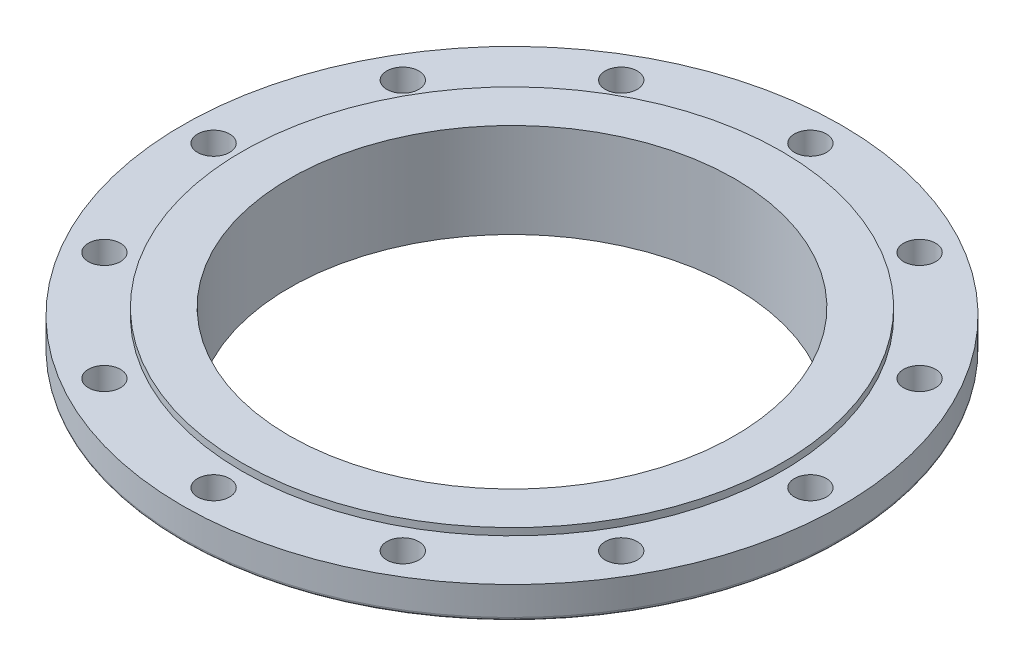
ISO-10303-21;
HEADER;
FILE_DESCRIPTION(('STEP AP214'),'2;1');
FILE_NAME('part.step','',(''),(''),'','','');
FILE_SCHEMA(('AUTOMOTIVE_DESIGN { 1 0 10303 214 1 1 1 1 }'));
ENDSEC;
DATA;
#1=APPLICATION_CONTEXT('core data for automotive mechanical design processes');
#2=APPLICATION_PROTOCOL_DEFINITION('international standard','automotive_design',2000,#1);
#3=PRODUCT_CONTEXT('',#1,'mechanical');
#4=PRODUCT('Part','Part','',(#3));
#5=PRODUCT_RELATED_PRODUCT_CATEGORY('part','',(#4));
#6=PRODUCT_DEFINITION_FORMATION('','',#4);
#7=PRODUCT_DEFINITION_CONTEXT('part definition',#1,'design');
#8=PRODUCT_DEFINITION('design','',#6,#7);
#9=PRODUCT_DEFINITION_SHAPE('','',#8);
#10=(LENGTH_UNIT() NAMED_UNIT(*) SI_UNIT(.MILLI.,.METRE.));
#11=(NAMED_UNIT(*) PLANE_ANGLE_UNIT() SI_UNIT($,.RADIAN.));
#12=(NAMED_UNIT(*) SI_UNIT($,.STERADIAN.) SOLID_ANGLE_UNIT());
#13=UNCERTAINTY_MEASURE_WITH_UNIT(LENGTH_MEASURE(1.E-05),#10,'distance_accuracy_value','');
#14=(GEOMETRIC_REPRESENTATION_CONTEXT(3) GLOBAL_UNCERTAINTY_ASSIGNED_CONTEXT((#13)) GLOBAL_UNIT_ASSIGNED_CONTEXT((#10,
#11,#12)) REPRESENTATION_CONTEXT('',''));
#15=CARTESIAN_POINT('',(0.,0.,0.));
#16=DIRECTION('',(0.,0.,1.));
#17=DIRECTION('',(1.,0.,0.));
#18=AXIS2_PLACEMENT_3D('',#15,#16,#17);
#19=CARTESIAN_POINT('',(-139.,0.,0.));
#20=DIRECTION('',(0.,1.,0.));
#21=DIRECTION('',(0.,0.,1.));
#22=AXIS2_PLACEMENT_3D('',#19,#20,#21);
#23=PLANE('',#22);
#24=CARTESIAN_POINT('',(0.,0.,0.));
#25=DIRECTION('',(0.,-1.,0.));
#26=DIRECTION('',(0.,0.,-1.));
#27=AXIS2_PLACEMENT_3D('',#24,#25,#26);
#28=CIRCLE('',#27,125.);
#29=CARTESIAN_POINT('',(0.,0.,-125.));
#30=VERTEX_POINT('',#29);
#31=EDGE_CURVE('E10',#30,#30,#28,.T.);
#32=ORIENTED_EDGE('',*,*,#31,.F.);
#33=EDGE_LOOP('',(#32));
#34=FACE_BOUND('',#33,.T.);
#35=CARTESIAN_POINT('',(0.,0.,0.));
#36=DIRECTION('',(0.,-1.,0.));
#37=DIRECTION('',(0.,0.,-1.));
#38=AXIS2_PLACEMENT_3D('',#35,#36,#37);
#39=CIRCLE('',#38,139.);
#40=CARTESIAN_POINT('',(0.,0.,-139.));
#41=VERTEX_POINT('',#40);
#42=EDGE_CURVE('E51',#41,#41,#39,.T.);
#43=ORIENTED_EDGE('',*,*,#42,.T.);
#44=EDGE_LOOP('',(#43));
#45=FACE_BOUND('',#44,.T.);
#46=ADVANCED_FACE('F32',(#34,#45),#23,.F.);
#47=CARTESIAN_POINT('',(0.,0.,0.));
#48=DIRECTION('',(0.,-1.,0.));
#49=DIRECTION('',(0.,0.,-1.));
#50=AXIS2_PLACEMENT_3D('',#47,#48,#49);
#51=CYLINDRICAL_SURFACE('',#50,125.);
#52=CARTESIAN_POINT('',(0.,53.,0.));
#53=DIRECTION('',(0.,-1.,0.));
#54=DIRECTION('',(0.,0.,-1.));
#55=AXIS2_PLACEMENT_3D('',#52,#53,#54);
#56=CIRCLE('',#55,125.);
#57=CARTESIAN_POINT('',(0.,53.,-125.));
#58=VERTEX_POINT('',#57);
#59=EDGE_CURVE('E39',#58,#58,#56,.T.);
#60=ORIENTED_EDGE('',*,*,#59,.F.);
#61=EDGE_LOOP('',(#60));
#62=FACE_BOUND('',#61,.T.);
#63=ORIENTED_EDGE('',*,*,#31,.T.);
#64=EDGE_LOOP('',(#63));
#65=FACE_BOUND('',#64,.T.);
#66=ADVANCED_FACE('F148',(#62,#65),#51,.F.);
#67=CARTESIAN_POINT('',(-151.5,53.,0.));
#68=DIRECTION('',(0.,-1.,0.));
#69=DIRECTION('',(0.,0.,-1.));
#70=AXIS2_PLACEMENT_3D('',#67,#68,#69);
#71=PLANE('',#70);
#72=CARTESIAN_POINT('',(0.,53.,0.));
#73=DIRECTION('',(0.,-1.,0.));
#74=DIRECTION('',(0.,0.,-1.));
#75=AXIS2_PLACEMENT_3D('',#72,#73,#74);
#76=CIRCLE('',#75,151.5);
#77=CARTESIAN_POINT('',(0.,53.,-151.5));
#78=VERTEX_POINT('',#77);
#79=EDGE_CURVE('E44',#78,#78,#76,.T.);
#80=ORIENTED_EDGE('',*,*,#79,.F.);
#81=EDGE_LOOP('',(#80));
#82=FACE_BOUND('',#81,.T.);
#83=ORIENTED_EDGE('',*,*,#59,.T.);
#84=EDGE_LOOP('',(#83));
#85=FACE_BOUND('',#84,.T.);
#86=ADVANCED_FACE('F145',(#82,#85),#71,.F.);
#87=CARTESIAN_POINT('',(0.,0.,0.));
#88=DIRECTION('',(0.,-1.,0.));
#89=DIRECTION('',(0.,0.,-1.));
#90=AXIS2_PLACEMENT_3D('',#87,#88,#89);
#91=CYLINDRICAL_SURFACE('',#90,151.5);
#92=CARTESIAN_POINT('',(0.,49.,0.));
#93=DIRECTION('',(0.,-1.,0.));
#94=DIRECTION('',(0.,0.,-1.));
#95=AXIS2_PLACEMENT_3D('',#92,#93,#94);
#96=CIRCLE('',#95,151.5);
#97=CARTESIAN_POINT('',(0.,49.,-151.5));
#98=VERTEX_POINT('',#97);
#99=EDGE_CURVE('E138',#98,#98,#96,.T.);
#100=ORIENTED_EDGE('',*,*,#99,.F.);
#101=EDGE_LOOP('',(#100));
#102=FACE_BOUND('',#101,.T.);
#103=ORIENTED_EDGE('',*,*,#79,.T.);
#104=EDGE_LOOP('',(#103));
#105=FACE_BOUND('',#104,.T.);
#106=ADVANCED_FACE('F143',(#102,#105),#91,.T.);
#107=CARTESIAN_POINT('',(-151.5,49.,0.));
#108=DIRECTION('',(0.,-1.,0.));
#109=DIRECTION('',(0.,0.,-1.));
#110=AXIS2_PLACEMENT_3D('',#107,#108,#109);
#111=PLANE('',#110);
#112=CARTESIAN_POINT('',(-145.059255133895,49.,83.7499999999981));
#113=DIRECTION('',(0.,1.,0.));
#114=DIRECTION('',(0.,0.,1.));
#115=AXIS2_PLACEMENT_3D('',#112,#113,#114);
#116=CIRCLE('',#115,9.00000000000001);
#117=CARTESIAN_POINT('',(-145.059255133895,49.,92.7499999999981));
#118=VERTEX_POINT('',#117);
#119=EDGE_CURVE('E100',#118,#118,#116,.T.);
#120=ORIENTED_EDGE('',*,*,#119,.F.);
#121=EDGE_LOOP('',(#120));
#122=FACE_BOUND('',#121,.T.);
#123=CARTESIAN_POINT('',(-83.7500000000017,49.,145.059255133893));
#124=DIRECTION('',(0.,1.,0.));
#125=DIRECTION('',(0.,0.,1.));
#126=AXIS2_PLACEMENT_3D('',#123,#124,#125);
#127=CIRCLE('',#126,9.);
#128=CARTESIAN_POINT('',(-83.7500000000017,49.,154.059255133893));
#129=VERTEX_POINT('',#128);
#130=EDGE_CURVE('E90',#129,#129,#127,.T.);
#131=ORIENTED_EDGE('',*,*,#130,.F.);
#132=EDGE_LOOP('',(#131));
#133=FACE_BOUND('',#132,.T.);
#134=CARTESIAN_POINT('',(-1.76664238793478E-12,49.,167.5));
#135=DIRECTION('',(0.,1.,0.));
#136=DIRECTION('',(0.,0.,1.));
#137=AXIS2_PLACEMENT_3D('',#134,#135,#136);
#138=CIRCLE('',#137,9.);
#139=CARTESIAN_POINT('',(-1.76664238793478E-12,49.,176.5));
#140=VERTEX_POINT('',#139);
#141=EDGE_CURVE('E87',#140,#140,#138,.T.);
#142=ORIENTED_EDGE('',*,*,#141,.F.);
#143=EDGE_LOOP('',(#142));
#144=FACE_BOUND('',#143,.T.);
#145=CARTESIAN_POINT('',(83.7499999999986,49.,145.059255133894));
#146=DIRECTION('',(0.,1.,0.));
#147=DIRECTION('',(0.,0.,1.));
#148=AXIS2_PLACEMENT_3D('',#145,#146,#147);
#149=CIRCLE('',#148,9.);
#150=CARTESIAN_POINT('',(83.7499999999986,49.,154.059255133894));
#151=VERTEX_POINT('',#150);
#152=EDGE_CURVE('E84',#151,#151,#149,.T.);
#153=ORIENTED_EDGE('',*,*,#152,.F.);
#154=EDGE_LOOP('',(#153));
#155=FACE_BOUND('',#154,.T.);
#156=CARTESIAN_POINT('',(145.059255133893,49.,83.7500000000012));
#157=DIRECTION('',(0.,1.,0.));
#158=DIRECTION('',(0.,0.,1.));
#159=AXIS2_PLACEMENT_3D('',#156,#157,#158);
#160=CIRCLE('',#159,9.00000000000001);
#161=CARTESIAN_POINT('',(145.059255133893,49.,92.7500000000012));
#162=VERTEX_POINT('',#161);
#163=EDGE_CURVE('E80',#162,#162,#160,.T.);
#164=ORIENTED_EDGE('',*,*,#163,.F.);
#165=EDGE_LOOP('',(#164));
#166=FACE_BOUND('',#165,.T.);
#167=CARTESIAN_POINT('',(167.5,49.,1.1715628467357E-12));
#168=DIRECTION('',(0.,1.,0.));
#169=DIRECTION('',(0.,0.,1.));
#170=AXIS2_PLACEMENT_3D('',#167,#168,#169);
#171=CIRCLE('',#170,9.00000000000001);
#172=CARTESIAN_POINT('',(167.5,49.,9.00000000000118));
#173=VERTEX_POINT('',#172);
#174=EDGE_CURVE('E76',#173,#173,#171,.T.);
#175=ORIENTED_EDGE('',*,*,#174,.F.);
#176=EDGE_LOOP('',(#175));
#177=FACE_BOUND('',#176,.T.);
#178=CARTESIAN_POINT('',(145.059255133894,49.,-83.7499999999992));
#179=DIRECTION('',(0.,1.,0.));
#180=DIRECTION('',(0.,0.,1.));
#181=AXIS2_PLACEMENT_3D('',#178,#179,#180);
#182=CIRCLE('',#181,9.00000000000001);
#183=CARTESIAN_POINT('',(145.059255133894,49.,-74.7499999999991));
#184=VERTEX_POINT('',#183);
#185=EDGE_CURVE('E72',#184,#184,#182,.T.);
#186=ORIENTED_EDGE('',*,*,#185,.F.);
#187=EDGE_LOOP('',(#186));
#188=FACE_BOUND('',#187,.T.);
#189=CARTESIAN_POINT('',(5.81948226921355E-13,49.,-167.5));
#190=DIRECTION('',(0.,1.,0.));
#191=DIRECTION('',(0.,0.,1.));
#192=AXIS2_PLACEMENT_3D('',#189,#190,#191);
#193=CIRCLE('',#192,9.);
#194=CARTESIAN_POINT('',(5.81948226921355E-13,49.,-158.5));
#195=VERTEX_POINT('',#194);
#196=EDGE_CURVE('E68',#195,#195,#193,.T.);
#197=ORIENTED_EDGE('',*,*,#196,.F.);
#198=EDGE_LOOP('',(#197));
#199=FACE_BOUND('',#198,.T.);
#200=CARTESIAN_POINT('',(-83.7499999999976,49.,-145.059255133895));
#201=DIRECTION('',(0.,1.,0.));
#202=DIRECTION('',(0.,0.,1.));
#203=AXIS2_PLACEMENT_3D('',#200,#201,#202);
#204=CIRCLE('',#203,9.);
#205=CARTESIAN_POINT('',(-83.7499999999976,49.,-136.059255133895));
#206=VERTEX_POINT('',#205);
#207=EDGE_CURVE('E64',#206,#206,#204,.T.);
#208=ORIENTED_EDGE('',*,*,#207,.F.);
#209=EDGE_LOOP('',(#208));
#210=FACE_BOUND('',#209,.T.);
#211=CARTESIAN_POINT('',(-145.059255133892,49.,-83.7500000000022));
#212=DIRECTION('',(0.,1.,0.));
#213=DIRECTION('',(0.,0.,1.));
#214=AXIS2_PLACEMENT_3D('',#211,#212,#213);
#215=CIRCLE('',#214,9.00000000000001);
#216=CARTESIAN_POINT('',(-145.059255133892,49.,-74.7500000000022));
#217=VERTEX_POINT('',#216);
#218=EDGE_CURVE('E60',#217,#217,#215,.T.);
#219=ORIENTED_EDGE('',*,*,#218,.F.);
#220=EDGE_LOOP('',(#219));
#221=FACE_BOUND('',#220,.T.);
#222=CARTESIAN_POINT('',(83.7500000000007,49.,-145.059255133893));
#223=DIRECTION('',(0.,1.,0.));
#224=DIRECTION('',(0.,0.,1.));
#225=AXIS2_PLACEMENT_3D('',#222,#223,#224);
#226=CIRCLE('',#225,9.);
#227=CARTESIAN_POINT('',(83.7500000000007,49.,-136.059255133893));
#228=VERTEX_POINT('',#227);
#229=EDGE_CURVE('E56',#228,#228,#226,.T.);
#230=ORIENTED_EDGE('',*,*,#229,.F.);
#231=EDGE_LOOP('',(#230));
#232=FACE_BOUND('',#231,.T.);
#233=CARTESIAN_POINT('',(-167.5,49.,0.));
#234=DIRECTION('',(0.,1.,0.));
#235=DIRECTION('',(0.,0.,1.));
#236=AXIS2_PLACEMENT_3D('',#233,#234,#235);
#237=CIRCLE('',#236,9.00000000000001);
#238=CARTESIAN_POINT('',(-167.5,49.,9.00000000000001));
#239=VERTEX_POINT('',#238);
#240=EDGE_CURVE('E52',#239,#239,#237,.T.);
#241=ORIENTED_EDGE('',*,*,#240,.F.);
#242=EDGE_LOOP('',(#241));
#243=FACE_BOUND('',#242,.T.);
#244=CARTESIAN_POINT('',(0.,49.,0.));
#245=DIRECTION('',(0.,-1.,0.));
#246=DIRECTION('',(0.,0.,-1.));
#247=AXIS2_PLACEMENT_3D('',#244,#245,#246);
#248=CIRCLE('',#247,185.);
#249=CARTESIAN_POINT('',(0.,49.,-185.));
#250=VERTEX_POINT('',#249);
#251=EDGE_CURVE('E135',#250,#250,#248,.T.);
#252=ORIENTED_EDGE('',*,*,#251,.F.);
#253=EDGE_LOOP('',(#252));
#254=FACE_BOUND('',#253,.T.);
#255=ORIENTED_EDGE('',*,*,#99,.T.);
#256=EDGE_LOOP('',(#255));
#257=FACE_BOUND('',#256,.T.);
#258=ADVANCED_FACE('F160',(#122,#133,#144,#155,#166,#177,#188,#199,#210,#221,#232,#243,#254,
#257),#111,.F.);
#259=CARTESIAN_POINT('',(0.,0.,0.));
#260=DIRECTION('',(0.,-1.,0.));
#261=DIRECTION('',(0.,0.,-1.));
#262=AXIS2_PLACEMENT_3D('',#259,#260,#261);
#263=CYLINDRICAL_SURFACE('',#262,185.);
#264=CARTESIAN_POINT('',(0.,33.,0.));
#265=DIRECTION('',(0.,-1.,0.));
#266=DIRECTION('',(0.,0.,-1.));
#267=AXIS2_PLACEMENT_3D('',#264,#265,#266);
#268=CIRCLE('',#267,185.);
#269=CARTESIAN_POINT('',(0.,33.,-185.));
#270=VERTEX_POINT('',#269);
#271=EDGE_CURVE('E132',#270,#270,#268,.T.);
#272=ORIENTED_EDGE('',*,*,#271,.F.);
#273=EDGE_LOOP('',(#272));
#274=FACE_BOUND('',#273,.T.);
#275=ORIENTED_EDGE('',*,*,#251,.T.);
#276=EDGE_LOOP('',(#275));
#277=FACE_BOUND('',#276,.T.);
#278=ADVANCED_FACE('F164',(#274,#277),#263,.T.);
#279=CARTESIAN_POINT('',(0.,33.,0.));
#280=DIRECTION('',(0.,-1.,0.));
#281=DIRECTION('',(0.,0.,-1.));
#282=AXIS2_PLACEMENT_3D('',#279,#280,#281);
#283=TOROIDAL_SURFACE('',#282,183.,2.);
#284=CARTESIAN_POINT('',(0.,31.,0.));
#285=DIRECTION('',(0.,-1.,0.));
#286=DIRECTION('',(0.,0.,-1.));
#287=AXIS2_PLACEMENT_3D('',#284,#285,#286);
#288=CIRCLE('',#287,183.);
#289=CARTESIAN_POINT('',(0.,31.,-183.));
#290=VERTEX_POINT('',#289);
#291=EDGE_CURVE('E129',#290,#290,#288,.T.);
#292=ORIENTED_EDGE('',*,*,#291,.F.);
#293=EDGE_LOOP('',(#292));
#294=FACE_BOUND('',#293,.T.);
#295=ORIENTED_EDGE('',*,*,#271,.T.);
#296=EDGE_LOOP('',(#295));
#297=FACE_BOUND('',#296,.T.);
#298=ADVANCED_FACE('F168',(#294,#297),#283,.T.);
#299=CARTESIAN_POINT('',(-183.,31.,0.));
#300=DIRECTION('',(0.,1.,0.));
#301=DIRECTION('',(0.,0.,1.));
#302=AXIS2_PLACEMENT_3D('',#299,#300,#301);
#303=PLANE('',#302);
#304=CARTESIAN_POINT('',(-145.059255133895,31.,83.7499999999981));
#305=DIRECTION('',(0.,1.,0.));
#306=DIRECTION('',(0.,0.,1.));
#307=AXIS2_PLACEMENT_3D('',#304,#305,#306);
#308=CIRCLE('',#307,9.00000000000001);
#309=CARTESIAN_POINT('',(-145.059255133895,31.,92.7499999999981));
#310=VERTEX_POINT('',#309);
#311=EDGE_CURVE('E35',#310,#310,#308,.T.);
#312=ORIENTED_EDGE('',*,*,#311,.T.);
#313=EDGE_LOOP('',(#312));
#314=FACE_BOUND('',#313,.T.);
#315=CARTESIAN_POINT('',(-83.7500000000017,31.,145.059255133893));
#316=DIRECTION('',(0.,1.,0.));
#317=DIRECTION('',(0.,0.,1.));
#318=AXIS2_PLACEMENT_3D('',#315,#316,#317);
#319=CIRCLE('',#318,9.);
#320=CARTESIAN_POINT('',(-83.7500000000017,31.,154.059255133893));
#321=VERTEX_POINT('',#320);
#322=EDGE_CURVE('E88',#321,#321,#319,.T.);
#323=ORIENTED_EDGE('',*,*,#322,.T.);
#324=EDGE_LOOP('',(#323));
#325=FACE_BOUND('',#324,.T.);
#326=CARTESIAN_POINT('',(-1.76664238793478E-12,31.,167.5));
#327=DIRECTION('',(0.,1.,0.));
#328=DIRECTION('',(0.,0.,1.));
#329=AXIS2_PLACEMENT_3D('',#326,#327,#328);
#330=CIRCLE('',#329,9.);
#331=CARTESIAN_POINT('',(-1.76664238793478E-12,31.,176.5));
#332=VERTEX_POINT('',#331);
#333=EDGE_CURVE('E85',#332,#332,#330,.T.);
#334=ORIENTED_EDGE('',*,*,#333,.T.);
#335=EDGE_LOOP('',(#334));
#336=FACE_BOUND('',#335,.T.);
#337=CARTESIAN_POINT('',(83.7499999999986,31.,145.059255133894));
#338=DIRECTION('',(0.,1.,0.));
#339=DIRECTION('',(0.,0.,1.));
#340=AXIS2_PLACEMENT_3D('',#337,#338,#339);
#341=CIRCLE('',#340,9.);
#342=CARTESIAN_POINT('',(83.7499999999986,31.,154.059255133894));
#343=VERTEX_POINT('',#342);
#344=EDGE_CURVE('E81',#343,#343,#341,.T.);
#345=ORIENTED_EDGE('',*,*,#344,.T.);
#346=EDGE_LOOP('',(#345));
#347=FACE_BOUND('',#346,.T.);
#348=CARTESIAN_POINT('',(145.059255133893,31.,83.7500000000012));
#349=DIRECTION('',(0.,1.,0.));
#350=DIRECTION('',(0.,0.,1.));
#351=AXIS2_PLACEMENT_3D('',#348,#349,#350);
#352=CIRCLE('',#351,9.00000000000001);
#353=CARTESIAN_POINT('',(145.059255133893,31.,92.7500000000012));
#354=VERTEX_POINT('',#353);
#355=EDGE_CURVE('E77',#354,#354,#352,.T.);
#356=ORIENTED_EDGE('',*,*,#355,.T.);
#357=EDGE_LOOP('',(#356));
#358=FACE_BOUND('',#357,.T.);
#359=CARTESIAN_POINT('',(167.5,31.,1.1715628467357E-12));
#360=DIRECTION('',(0.,1.,0.));
#361=DIRECTION('',(0.,0.,1.));
#362=AXIS2_PLACEMENT_3D('',#359,#360,#361);
#363=CIRCLE('',#362,9.00000000000001);
#364=CARTESIAN_POINT('',(167.5,31.,9.00000000000118));
#365=VERTEX_POINT('',#364);
#366=EDGE_CURVE('E73',#365,#365,#363,.T.);
#367=ORIENTED_EDGE('',*,*,#366,.T.);
#368=EDGE_LOOP('',(#367));
#369=FACE_BOUND('',#368,.T.);
#370=CARTESIAN_POINT('',(145.059255133894,31.,-83.7499999999992));
#371=DIRECTION('',(0.,1.,0.));
#372=DIRECTION('',(0.,0.,1.));
#373=AXIS2_PLACEMENT_3D('',#370,#371,#372);
#374=CIRCLE('',#373,9.00000000000001);
#375=CARTESIAN_POINT('',(145.059255133894,31.,-74.7499999999991));
#376=VERTEX_POINT('',#375);
#377=EDGE_CURVE('E69',#376,#376,#374,.T.);
#378=ORIENTED_EDGE('',*,*,#377,.T.);
#379=EDGE_LOOP('',(#378));
#380=FACE_BOUND('',#379,.T.);
#381=CARTESIAN_POINT('',(5.81948226921355E-13,31.,-167.5));
#382=DIRECTION('',(0.,1.,0.));
#383=DIRECTION('',(0.,0.,1.));
#384=AXIS2_PLACEMENT_3D('',#381,#382,#383);
#385=CIRCLE('',#384,9.);
#386=CARTESIAN_POINT('',(5.81948226921355E-13,31.,-158.5));
#387=VERTEX_POINT('',#386);
#388=EDGE_CURVE('E65',#387,#387,#385,.T.);
#389=ORIENTED_EDGE('',*,*,#388,.T.);
#390=EDGE_LOOP('',(#389));
#391=FACE_BOUND('',#390,.T.);
#392=CARTESIAN_POINT('',(-83.7499999999976,31.,-145.059255133895));
#393=DIRECTION('',(0.,1.,0.));
#394=DIRECTION('',(0.,0.,1.));
#395=AXIS2_PLACEMENT_3D('',#392,#393,#394);
#396=CIRCLE('',#395,9.);
#397=CARTESIAN_POINT('',(-83.7499999999976,31.,-136.059255133895));
#398=VERTEX_POINT('',#397);
#399=EDGE_CURVE('E61',#398,#398,#396,.T.);
#400=ORIENTED_EDGE('',*,*,#399,.T.);
#401=EDGE_LOOP('',(#400));
#402=FACE_BOUND('',#401,.T.);
#403=CARTESIAN_POINT('',(-145.059255133892,31.,-83.7500000000022));
#404=DIRECTION('',(0.,1.,0.));
#405=DIRECTION('',(0.,0.,1.));
#406=AXIS2_PLACEMENT_3D('',#403,#404,#405);
#407=CIRCLE('',#406,9.00000000000001);
#408=CARTESIAN_POINT('',(-145.059255133892,31.,-74.7500000000022));
#409=VERTEX_POINT('',#408);
#410=EDGE_CURVE('E57',#409,#409,#407,.T.);
#411=ORIENTED_EDGE('',*,*,#410,.T.);
#412=EDGE_LOOP('',(#411));
#413=FACE_BOUND('',#412,.T.);
#414=CARTESIAN_POINT('',(83.7500000000007,31.,-145.059255133893));
#415=DIRECTION('',(0.,1.,0.));
#416=DIRECTION('',(0.,0.,1.));
#417=AXIS2_PLACEMENT_3D('',#414,#415,#416);
#418=CIRCLE('',#417,9.);
#419=CARTESIAN_POINT('',(83.7500000000007,31.,-136.059255133893));
#420=VERTEX_POINT('',#419);
#421=EDGE_CURVE('E53',#420,#420,#418,.T.);
#422=ORIENTED_EDGE('',*,*,#421,.T.);
#423=EDGE_LOOP('',(#422));
#424=FACE_BOUND('',#423,.T.);
#425=CARTESIAN_POINT('',(-167.5,31.,0.));
#426=DIRECTION('',(0.,1.,0.));
#427=DIRECTION('',(0.,0.,1.));
#428=AXIS2_PLACEMENT_3D('',#425,#426,#427);
#429=CIRCLE('',#428,9.00000000000001);
#430=CARTESIAN_POINT('',(-167.5,31.,9.00000000000001));
#431=VERTEX_POINT('',#430);
#432=EDGE_CURVE('E48',#431,#431,#429,.T.);
#433=ORIENTED_EDGE('',*,*,#432,.T.);
#434=EDGE_LOOP('',(#433));
#435=FACE_BOUND('',#434,.T.);
#436=CARTESIAN_POINT('',(0.,31.,0.));
#437=DIRECTION('',(0.,-1.,0.));
#438=DIRECTION('',(0.,0.,-1.));
#439=AXIS2_PLACEMENT_3D('',#436,#437,#438);
#440=CIRCLE('',#439,149.961434146887);
#441=CARTESIAN_POINT('',(0.,31.,-149.961434146887));
#442=VERTEX_POINT('',#441);
#443=EDGE_CURVE('E126',#442,#442,#440,.T.);
#444=ORIENTED_EDGE('',*,*,#443,.F.);
#445=EDGE_LOOP('',(#444));
#446=FACE_BOUND('',#445,.T.);
#447=ORIENTED_EDGE('',*,*,#291,.T.);
#448=EDGE_LOOP('',(#447));
#449=FACE_BOUND('',#448,.T.);
#450=ADVANCED_FACE('F172',(#314,#325,#336,#347,#358,#369,#380,#391,#402,#413,#424,#435,#446,
#449),#303,.F.);
#451=CARTESIAN_POINT('',(0.,24.,0.));
#452=DIRECTION('',(0.,-1.,0.));
#453=DIRECTION('',(0.,0.,-1.));
#454=AXIS2_PLACEMENT_3D('',#451,#452,#453);
#455=TOROIDAL_SURFACE('',#454,149.961434146887,6.99999999999999);
#456=CARTESIAN_POINT('',(0.,25.1146270717723,0.));
#457=DIRECTION('',(0.,-1.,0.));
#458=DIRECTION('',(0.,0.,-1.));
#459=AXIS2_PLACEMENT_3D('',#456,#457,#458);
#460=CIRCLE('',#459,143.050746301899);
#461=CARTESIAN_POINT('',(0.,25.1146270717723,-143.050746301899));
#462=VERTEX_POINT('',#461);
#463=EDGE_CURVE('E123',#462,#462,#460,.T.);
#464=ORIENTED_EDGE('',*,*,#463,.F.);
#465=EDGE_LOOP('',(#464));
#466=FACE_BOUND('',#465,.T.);
#467=ORIENTED_EDGE('',*,*,#443,.T.);
#468=EDGE_LOOP('',(#467));
#469=FACE_BOUND('',#468,.T.);
#470=ADVANCED_FACE('F176',(#466,#469),#455,.F.);
#471=CARTESIAN_POINT('',(0.,25.1146270717723,0.));
#472=DIRECTION('',(0.,1.,0.));
#473=DIRECTION('',(0.,0.,1.));
#474=AXIS2_PLACEMENT_3D('',#471,#472,#473);
#475=CONICAL_SURFACE('',#474,143.050746301899,0.15991312315822);
#476=ORIENTED_EDGE('',*,*,#42,.F.);
#477=EDGE_LOOP('',(#476));
#478=FACE_BOUND('',#477,.T.);
#479=ORIENTED_EDGE('',*,*,#463,.T.);
#480=EDGE_LOOP('',(#479));
#481=FACE_BOUND('',#480,.T.);
#482=ADVANCED_FACE('F180',(#478,#481),#475,.T.);
#483=CARTESIAN_POINT('',(-167.5,0.,0.));
#484=DIRECTION('',(0.,1.,0.));
#485=DIRECTION('',(0.,0.,1.));
#486=AXIS2_PLACEMENT_3D('',#483,#484,#485);
#487=CYLINDRICAL_SURFACE('',#486,9.00000000000001);
#488=ORIENTED_EDGE('',*,*,#240,.T.);
#489=EDGE_LOOP('',(#488));
#490=FACE_BOUND('',#489,.T.);
#491=ORIENTED_EDGE('',*,*,#432,.F.);
#492=EDGE_LOOP('',(#491));
#493=FACE_BOUND('',#492,.T.);
#494=ADVANCED_FACE('F184',(#490,#493),#487,.F.);
#495=CARTESIAN_POINT('',(83.7500000000007,0.,-145.059255133893));
#496=DIRECTION('',(0.,1.,0.));
#497=DIRECTION('',(0.,0.,1.));
#498=AXIS2_PLACEMENT_3D('',#495,#496,#497);
#499=CYLINDRICAL_SURFACE('',#498,9.);
#500=ORIENTED_EDGE('',*,*,#229,.T.);
#501=EDGE_LOOP('',(#500));
#502=FACE_BOUND('',#501,.T.);
#503=ORIENTED_EDGE('',*,*,#421,.F.);
#504=EDGE_LOOP('',(#503));
#505=FACE_BOUND('',#504,.T.);
#506=ADVANCED_FACE('F188',(#502,#505),#499,.F.);
#507=CARTESIAN_POINT('',(-145.059255133892,0.,-83.7500000000022));
#508=DIRECTION('',(0.,1.,0.));
#509=DIRECTION('',(0.,0.,1.));
#510=AXIS2_PLACEMENT_3D('',#507,#508,#509);
#511=CYLINDRICAL_SURFACE('',#510,9.00000000000001);
#512=ORIENTED_EDGE('',*,*,#218,.T.);
#513=EDGE_LOOP('',(#512));
#514=FACE_BOUND('',#513,.T.);
#515=ORIENTED_EDGE('',*,*,#410,.F.);
#516=EDGE_LOOP('',(#515));
#517=FACE_BOUND('',#516,.T.);
#518=ADVANCED_FACE('F192',(#514,#517),#511,.F.);
#519=CARTESIAN_POINT('',(-83.7499999999976,0.,-145.059255133895));
#520=DIRECTION('',(0.,1.,0.));
#521=DIRECTION('',(0.,0.,1.));
#522=AXIS2_PLACEMENT_3D('',#519,#520,#521);
#523=CYLINDRICAL_SURFACE('',#522,9.);
#524=ORIENTED_EDGE('',*,*,#207,.T.);
#525=EDGE_LOOP('',(#524));
#526=FACE_BOUND('',#525,.T.);
#527=ORIENTED_EDGE('',*,*,#399,.F.);
#528=EDGE_LOOP('',(#527));
#529=FACE_BOUND('',#528,.T.);
#530=ADVANCED_FACE('F196',(#526,#529),#523,.F.);
#531=CARTESIAN_POINT('',(5.81948226921355E-13,0.,-167.5));
#532=DIRECTION('',(0.,1.,0.));
#533=DIRECTION('',(0.,0.,1.));
#534=AXIS2_PLACEMENT_3D('',#531,#532,#533);
#535=CYLINDRICAL_SURFACE('',#534,9.);
#536=ORIENTED_EDGE('',*,*,#196,.T.);
#537=EDGE_LOOP('',(#536));
#538=FACE_BOUND('',#537,.T.);
#539=ORIENTED_EDGE('',*,*,#388,.F.);
#540=EDGE_LOOP('',(#539));
#541=FACE_BOUND('',#540,.T.);
#542=ADVANCED_FACE('F200',(#538,#541),#535,.F.);
#543=CARTESIAN_POINT('',(145.059255133894,0.,-83.7499999999992));
#544=DIRECTION('',(0.,1.,0.));
#545=DIRECTION('',(0.,0.,1.));
#546=AXIS2_PLACEMENT_3D('',#543,#544,#545);
#547=CYLINDRICAL_SURFACE('',#546,9.00000000000001);
#548=ORIENTED_EDGE('',*,*,#185,.T.);
#549=EDGE_LOOP('',(#548));
#550=FACE_BOUND('',#549,.T.);
#551=ORIENTED_EDGE('',*,*,#377,.F.);
#552=EDGE_LOOP('',(#551));
#553=FACE_BOUND('',#552,.T.);
#554=ADVANCED_FACE('F204',(#550,#553),#547,.F.);
#555=CARTESIAN_POINT('',(167.5,0.,1.1715628467357E-12));
#556=DIRECTION('',(0.,1.,0.));
#557=DIRECTION('',(0.,0.,1.));
#558=AXIS2_PLACEMENT_3D('',#555,#556,#557);
#559=CYLINDRICAL_SURFACE('',#558,9.00000000000001);
#560=ORIENTED_EDGE('',*,*,#174,.T.);
#561=EDGE_LOOP('',(#560));
#562=FACE_BOUND('',#561,.T.);
#563=ORIENTED_EDGE('',*,*,#366,.F.);
#564=EDGE_LOOP('',(#563));
#565=FACE_BOUND('',#564,.T.);
#566=ADVANCED_FACE('F208',(#562,#565),#559,.F.);
#567=CARTESIAN_POINT('',(145.059255133893,0.,83.7500000000012));
#568=DIRECTION('',(0.,1.,0.));
#569=DIRECTION('',(0.,0.,1.));
#570=AXIS2_PLACEMENT_3D('',#567,#568,#569);
#571=CYLINDRICAL_SURFACE('',#570,9.00000000000001);
#572=ORIENTED_EDGE('',*,*,#163,.T.);
#573=EDGE_LOOP('',(#572));
#574=FACE_BOUND('',#573,.T.);
#575=ORIENTED_EDGE('',*,*,#355,.F.);
#576=EDGE_LOOP('',(#575));
#577=FACE_BOUND('',#576,.T.);
#578=ADVANCED_FACE('F212',(#574,#577),#571,.F.);
#579=CARTESIAN_POINT('',(83.7499999999986,0.,145.059255133894));
#580=DIRECTION('',(0.,1.,0.));
#581=DIRECTION('',(0.,0.,1.));
#582=AXIS2_PLACEMENT_3D('',#579,#580,#581);
#583=CYLINDRICAL_SURFACE('',#582,9.);
#584=ORIENTED_EDGE('',*,*,#152,.T.);
#585=EDGE_LOOP('',(#584));
#586=FACE_BOUND('',#585,.T.);
#587=ORIENTED_EDGE('',*,*,#344,.F.);
#588=EDGE_LOOP('',(#587));
#589=FACE_BOUND('',#588,.T.);
#590=ADVANCED_FACE('F216',(#586,#589),#583,.F.);
#591=CARTESIAN_POINT('',(-1.76664238793478E-12,0.,167.5));
#592=DIRECTION('',(0.,1.,0.));
#593=DIRECTION('',(0.,0.,1.));
#594=AXIS2_PLACEMENT_3D('',#591,#592,#593);
#595=CYLINDRICAL_SURFACE('',#594,9.);
#596=ORIENTED_EDGE('',*,*,#141,.T.);
#597=EDGE_LOOP('',(#596));
#598=FACE_BOUND('',#597,.T.);
#599=ORIENTED_EDGE('',*,*,#333,.F.);
#600=EDGE_LOOP('',(#599));
#601=FACE_BOUND('',#600,.T.);
#602=ADVANCED_FACE('F220',(#598,#601),#595,.F.);
#603=CARTESIAN_POINT('',(-83.7500000000017,0.,145.059255133893));
#604=DIRECTION('',(0.,1.,0.));
#605=DIRECTION('',(0.,0.,1.));
#606=AXIS2_PLACEMENT_3D('',#603,#604,#605);
#607=CYLINDRICAL_SURFACE('',#606,9.);
#608=ORIENTED_EDGE('',*,*,#130,.T.);
#609=EDGE_LOOP('',(#608));
#610=FACE_BOUND('',#609,.T.);
#611=ORIENTED_EDGE('',*,*,#322,.F.);
#612=EDGE_LOOP('',(#611));
#613=FACE_BOUND('',#612,.T.);
#614=ADVANCED_FACE('F224',(#610,#613),#607,.F.);
#615=CARTESIAN_POINT('',(-145.059255133895,0.,83.7499999999981));
#616=DIRECTION('',(0.,1.,0.));
#617=DIRECTION('',(0.,0.,1.));
#618=AXIS2_PLACEMENT_3D('',#615,#616,#617);
#619=CYLINDRICAL_SURFACE('',#618,9.00000000000001);
#620=ORIENTED_EDGE('',*,*,#119,.T.);
#621=EDGE_LOOP('',(#620));
#622=FACE_BOUND('',#621,.T.);
#623=ORIENTED_EDGE('',*,*,#311,.F.);
#624=EDGE_LOOP('',(#623));
#625=FACE_BOUND('',#624,.T.);
#626=ADVANCED_FACE('F228',(#622,#625),#619,.F.);
#627=CLOSED_SHELL('',(#46,#66,#86,#106,#258,#278,#298,#450,#470,#482,#494,#506,#518,#530,#542,
#554,#566,#578,#590,#602,#614,#626));
#628=MANIFOLD_SOLID_BREP('B2',#627);
#629=ADVANCED_BREP_SHAPE_REPRESENTATION('',(#18,#628),#14);
#630=SHAPE_DEFINITION_REPRESENTATION(#9,#629);
ENDSEC;
END-ISO-10303-21;
